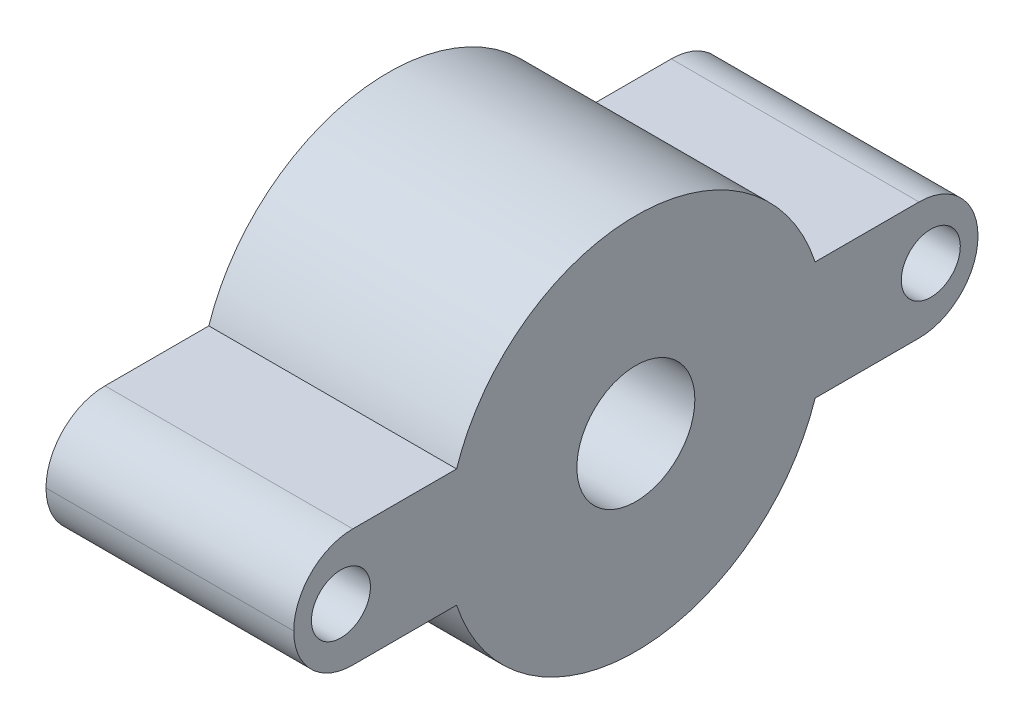
ISO-10303-21;
HEADER;
FILE_DESCRIPTION(('STEP AP214'),'2;1');
FILE_NAME('part.step','',(''),(''),'','','');
FILE_SCHEMA(('AUTOMOTIVE_DESIGN { 1 0 10303 214 1 1 1 1 }'));
ENDSEC;
DATA;
#1=APPLICATION_CONTEXT('core data for automotive mechanical design processes');
#2=APPLICATION_PROTOCOL_DEFINITION('international standard','automotive_design',2000,#1);
#3=PRODUCT_CONTEXT('',#1,'mechanical');
#4=PRODUCT('Part','Part','',(#3));
#5=PRODUCT_RELATED_PRODUCT_CATEGORY('part','',(#4));
#6=PRODUCT_DEFINITION_FORMATION('','',#4);
#7=PRODUCT_DEFINITION_CONTEXT('part definition',#1,'design');
#8=PRODUCT_DEFINITION('design','',#6,#7);
#9=PRODUCT_DEFINITION_SHAPE('','',#8);
#10=(LENGTH_UNIT() NAMED_UNIT(*) SI_UNIT(.MILLI.,.METRE.));
#11=(NAMED_UNIT(*) PLANE_ANGLE_UNIT() SI_UNIT($,.RADIAN.));
#12=(NAMED_UNIT(*) SI_UNIT($,.STERADIAN.) SOLID_ANGLE_UNIT());
#13=UNCERTAINTY_MEASURE_WITH_UNIT(LENGTH_MEASURE(1.E-05),#10,'distance_accuracy_value','');
#14=(GEOMETRIC_REPRESENTATION_CONTEXT(3) GLOBAL_UNCERTAINTY_ASSIGNED_CONTEXT((#13)) GLOBAL_UNIT_ASSIGNED_CONTEXT((#10,
#11,#12)) REPRESENTATION_CONTEXT('',''));
#15=CARTESIAN_POINT('',(0.,0.,0.));
#16=DIRECTION('',(0.,0.,1.));
#17=DIRECTION('',(1.,0.,0.));
#18=AXIS2_PLACEMENT_3D('',#15,#16,#17);
#19=CARTESIAN_POINT('',(5.,5.,-59.));
#20=DIRECTION('',(1.,0.,0.));
#21=DIRECTION('',(0.,0.,-1.));
#22=AXIS2_PLACEMENT_3D('',#19,#20,#21);
#23=CYLINDRICAL_SURFACE('',#22,5.);
#24=DIRECTION('',(1.,0.,0.));
#25=VECTOR('',#24,1.);
#26=CARTESIAN_POINT('',(5.,0.,-59.));
#27=LINE('',#26,#25);
#28=CARTESIAN_POINT('',(0.,0.,-59.));
#29=VERTEX_POINT('',#28);
#30=CARTESIAN_POINT('',(21.,0.,-59.));
#31=VERTEX_POINT('',#30);
#32=EDGE_CURVE('E190',#29,#31,#27,.T.);
#33=ORIENTED_EDGE('',*,*,#32,.F.);
#34=CARTESIAN_POINT('',(0.,5.,-59.));
#35=DIRECTION('',(-1.,0.,0.));
#36=DIRECTION('',(0.,0.,1.));
#37=AXIS2_PLACEMENT_3D('',#34,#35,#36);
#38=CIRCLE('',#37,5.);
#39=CARTESIAN_POINT('',(0.,5.,-64.));
#40=VERTEX_POINT('',#39);
#41=EDGE_CURVE('E39',#40,#29,#38,.T.);
#42=ORIENTED_EDGE('',*,*,#41,.F.);
#43=DIRECTION('',(-1.,0.,0.));
#44=VECTOR('',#43,1.);
#45=CARTESIAN_POINT('',(40.,5.,-64.));
#46=LINE('',#45,#44);
#47=CARTESIAN_POINT('',(21.,5.,-64.));
#48=VERTEX_POINT('',#47);
#49=EDGE_CURVE('E169',#40,#48,#46,.F.);
#50=ORIENTED_EDGE('',*,*,#49,.T.);
#51=CARTESIAN_POINT('',(21.,5.,-59.));
#52=DIRECTION('',(1.,0.,0.));
#53=DIRECTION('',(0.,0.,-1.));
#54=AXIS2_PLACEMENT_3D('',#51,#52,#53);
#55=CIRCLE('',#54,5.);
#56=EDGE_CURVE('E11',#31,#48,#55,.T.);
#57=ORIENTED_EDGE('',*,*,#56,.F.);
#58=EDGE_LOOP('',(#33,#42,#50,#57));
#59=FACE_BOUND('',#58,.T.);
#60=ADVANCED_FACE('F32',(#59),#23,.T.);
#61=CARTESIAN_POINT('',(40.,5.,-11.));
#62=DIRECTION('',(1.,0.,0.));
#63=DIRECTION('',(0.,0.,-1.));
#64=AXIS2_PLACEMENT_3D('',#61,#62,#63);
#65=CYLINDRICAL_SURFACE('',#64,5.);
#66=DIRECTION('',(1.,0.,0.));
#67=VECTOR('',#66,1.);
#68=CARTESIAN_POINT('',(40.,5.,-6.));
#69=LINE('',#68,#67);
#70=CARTESIAN_POINT('',(21.,5.,-5.99999999999999));
#71=VERTEX_POINT('',#70);
#72=CARTESIAN_POINT('',(0.,5.,-6.));
#73=VERTEX_POINT('',#72);
#74=EDGE_CURVE('E176',#71,#73,#69,.F.);
#75=ORIENTED_EDGE('',*,*,#74,.T.);
#76=CARTESIAN_POINT('',(0.,5.,-11.));
#77=DIRECTION('',(-1.,0.,0.));
#78=DIRECTION('',(0.,0.,1.));
#79=AXIS2_PLACEMENT_3D('',#76,#77,#78);
#80=CIRCLE('',#79,5.);
#81=CARTESIAN_POINT('',(0.,0.,-11.));
#82=VERTEX_POINT('',#81);
#83=EDGE_CURVE('E186',#82,#73,#80,.T.);
#84=ORIENTED_EDGE('',*,*,#83,.F.);
#85=DIRECTION('',(1.,0.,0.));
#86=VECTOR('',#85,1.);
#87=CARTESIAN_POINT('',(5.,0.,-11.));
#88=LINE('',#87,#86);
#89=CARTESIAN_POINT('',(21.,0.,-11.));
#90=VERTEX_POINT('',#89);
#91=EDGE_CURVE('E183',#90,#82,#88,.F.);
#92=ORIENTED_EDGE('',*,*,#91,.F.);
#93=CARTESIAN_POINT('',(21.,5.,-11.));
#94=DIRECTION('',(1.,0.,0.));
#95=DIRECTION('',(0.,0.,-1.));
#96=AXIS2_PLACEMENT_3D('',#93,#94,#95);
#97=CIRCLE('',#96,5.);
#98=EDGE_CURVE('E188',#71,#90,#97,.T.);
#99=ORIENTED_EDGE('',*,*,#98,.F.);
#100=EDGE_LOOP('',(#75,#84,#92,#99));
#101=FACE_BOUND('',#100,.T.);
#102=ADVANCED_FACE('F219',(#101),#65,.T.);
#103=CARTESIAN_POINT('',(5.,5.,-11.));
#104=DIRECTION('',(1.,0.,0.));
#105=DIRECTION('',(0.,0.,-1.));
#106=AXIS2_PLACEMENT_3D('',#103,#104,#105);
#107=CYLINDRICAL_SURFACE('',#106,5.);
#108=DIRECTION('',(1.,0.,0.));
#109=VECTOR('',#108,1.);
#110=CARTESIAN_POINT('',(5.,10.,-11.));
#111=LINE('',#110,#109);
#112=CARTESIAN_POINT('',(0.,10.,-11.));
#113=VERTEX_POINT('',#112);
#114=CARTESIAN_POINT('',(21.,10.,-11.));
#115=VERTEX_POINT('',#114);
#116=EDGE_CURVE('E124',#113,#115,#111,.T.);
#117=ORIENTED_EDGE('',*,*,#116,.F.);
#118=CARTESIAN_POINT('',(0.,5.,-11.));
#119=DIRECTION('',(-1.,0.,0.));
#120=DIRECTION('',(0.,0.,1.));
#121=AXIS2_PLACEMENT_3D('',#118,#119,#120);
#122=CIRCLE('',#121,5.);
#123=EDGE_CURVE('E179',#73,#113,#122,.T.);
#124=ORIENTED_EDGE('',*,*,#123,.F.);
#125=ORIENTED_EDGE('',*,*,#74,.F.);
#126=CARTESIAN_POINT('',(21.,5.,-11.));
#127=DIRECTION('',(1.,0.,0.));
#128=DIRECTION('',(0.,0.,-1.));
#129=AXIS2_PLACEMENT_3D('',#126,#127,#128);
#130=CIRCLE('',#129,5.);
#131=EDGE_CURVE('E181',#115,#71,#130,.T.);
#132=ORIENTED_EDGE('',*,*,#131,.F.);
#133=EDGE_LOOP('',(#117,#124,#125,#132));
#134=FACE_BOUND('',#133,.T.);
#135=ADVANCED_FACE('F222',(#134),#107,.T.);
#136=CARTESIAN_POINT('',(5.,5.,-59.));
#137=DIRECTION('',(-1.,0.,0.));
#138=DIRECTION('',(0.,0.,1.));
#139=AXIS2_PLACEMENT_3D('',#136,#137,#138);
#140=CYLINDRICAL_SURFACE('',#139,5.);
#141=DIRECTION('',(-1.,0.,0.));
#142=VECTOR('',#141,1.);
#143=CARTESIAN_POINT('',(5.,10.,-59.));
#144=LINE('',#143,#142);
#145=CARTESIAN_POINT('',(21.,10.,-59.));
#146=VERTEX_POINT('',#145);
#147=CARTESIAN_POINT('',(0.,10.,-59.));
#148=VERTEX_POINT('',#147);
#149=EDGE_CURVE('E152',#146,#148,#144,.T.);
#150=ORIENTED_EDGE('',*,*,#149,.F.);
#151=CARTESIAN_POINT('',(21.,5.,-59.));
#152=DIRECTION('',(1.,0.,0.));
#153=DIRECTION('',(0.,0.,-1.));
#154=AXIS2_PLACEMENT_3D('',#151,#152,#153);
#155=CIRCLE('',#154,5.);
#156=EDGE_CURVE('E171',#48,#146,#155,.T.);
#157=ORIENTED_EDGE('',*,*,#156,.F.);
#158=ORIENTED_EDGE('',*,*,#49,.F.);
#159=CARTESIAN_POINT('',(0.,5.,-59.));
#160=DIRECTION('',(-1.,0.,0.));
#161=DIRECTION('',(0.,0.,1.));
#162=AXIS2_PLACEMENT_3D('',#159,#160,#161);
#163=CIRCLE('',#162,5.);
#164=EDGE_CURVE('E173',#148,#40,#163,.T.);
#165=ORIENTED_EDGE('',*,*,#164,.F.);
#166=EDGE_LOOP('',(#150,#157,#158,#165));
#167=FACE_BOUND('',#166,.T.);
#168=ADVANCED_FACE('F229',(#167),#140,.T.);
#169=CARTESIAN_POINT('',(21.,5.,-35.));
#170=DIRECTION('',(-1.,0.,0.));
#171=DIRECTION('',(0.,0.,1.));
#172=AXIS2_PLACEMENT_3D('',#169,#170,#171);
#173=CYLINDRICAL_SURFACE('',#172,16.);
#174=DIRECTION('',(-1.,0.,0.));
#175=VECTOR('',#174,1.);
#176=CARTESIAN_POINT('',(21.,0.,-50.1986841535707));
#177=LINE('',#176,#175);
#178=CARTESIAN_POINT('',(0.,0.,-50.1986841535707));
#179=VERTEX_POINT('',#178);
#180=CARTESIAN_POINT('',(21.,0.,-50.1986841535707));
#181=VERTEX_POINT('',#180);
#182=EDGE_CURVE('E144',#179,#181,#177,.F.);
#183=ORIENTED_EDGE('',*,*,#182,.T.);
#184=CARTESIAN_POINT('',(21.,5.,-35.));
#185=DIRECTION('',(1.,0.,0.));
#186=DIRECTION('',(0.,0.,-1.));
#187=AXIS2_PLACEMENT_3D('',#184,#185,#186);
#188=CIRCLE('',#187,16.);
#189=CARTESIAN_POINT('',(21.,0.,-19.8013158464293));
#190=VERTEX_POINT('',#189);
#191=EDGE_CURVE('E135',#190,#181,#188,.T.);
#192=ORIENTED_EDGE('',*,*,#191,.F.);
#193=DIRECTION('',(-1.,0.,0.));
#194=VECTOR('',#193,1.);
#195=CARTESIAN_POINT('',(21.,0.,-19.8013158464293));
#196=LINE('',#195,#194);
#197=CARTESIAN_POINT('',(0.,0.,-19.8013158464293));
#198=VERTEX_POINT('',#197);
#199=EDGE_CURVE('E117',#190,#198,#196,.T.);
#200=ORIENTED_EDGE('',*,*,#199,.T.);
#201=CARTESIAN_POINT('',(0.,5.,-35.));
#202=DIRECTION('',(1.,0.,0.));
#203=DIRECTION('',(0.,0.,-1.));
#204=AXIS2_PLACEMENT_3D('',#201,#202,#203);
#205=CIRCLE('',#204,16.);
#206=EDGE_CURVE('E204',#198,#179,#205,.T.);
#207=ORIENTED_EDGE('',*,*,#206,.T.);
#208=EDGE_LOOP('',(#183,#192,#200,#207));
#209=FACE_BOUND('',#208,.T.);
#210=ADVANCED_FACE('F208',(#209),#173,.T.);
#211=DIRECTION('',(-1.,0.,0.));
#212=VECTOR('',#211,1.);
#213=CARTESIAN_POINT('',(21.,10.,-19.8013158464293));
#214=LINE('',#213,#212);
#215=CARTESIAN_POINT('',(0.,10.,-19.8013158464293));
#216=VERTEX_POINT('',#215);
#217=CARTESIAN_POINT('',(21.,10.,-19.8013158464293));
#218=VERTEX_POINT('',#217);
#219=EDGE_CURVE('E106',#216,#218,#214,.F.);
#220=ORIENTED_EDGE('',*,*,#219,.T.);
#221=CARTESIAN_POINT('',(21.,10.,-50.1986841535707));
#222=VERTEX_POINT('',#221);
#223=EDGE_CURVE('E111',#222,#218,#188,.T.);
#224=ORIENTED_EDGE('',*,*,#223,.F.);
#225=DIRECTION('',(-1.,0.,0.));
#226=VECTOR('',#225,1.);
#227=CARTESIAN_POINT('',(21.,10.,-50.1986841535707));
#228=LINE('',#227,#226);
#229=CARTESIAN_POINT('',(0.,10.,-50.1986841535707));
#230=VERTEX_POINT('',#229);
#231=EDGE_CURVE('E142',#222,#230,#228,.T.);
#232=ORIENTED_EDGE('',*,*,#231,.T.);
#233=EDGE_CURVE('E113',#230,#216,#205,.T.);
#234=ORIENTED_EDGE('',*,*,#233,.T.);
#235=EDGE_LOOP('',(#220,#224,#232,#234));
#236=FACE_BOUND('',#235,.T.);
#237=ADVANCED_FACE('F108',(#236),#173,.T.);
#238=CARTESIAN_POINT('',(5.,0.,0.));
#239=DIRECTION('',(0.,1.,0.));
#240=DIRECTION('',(0.,0.,1.));
#241=AXIS2_PLACEMENT_3D('',#238,#239,#240);
#242=PLANE('',#241);
#243=DIRECTION('',(0.,0.,-1.));
#244=VECTOR('',#243,1.);
#245=CARTESIAN_POINT('',(0.,0.,0.));
#246=LINE('',#245,#244);
#247=EDGE_CURVE('E146',#179,#29,#246,.T.);
#248=ORIENTED_EDGE('',*,*,#247,.T.);
#249=ORIENTED_EDGE('',*,*,#32,.T.);
#250=DIRECTION('',(0.,0.,-1.));
#251=VECTOR('',#250,1.);
#252=CARTESIAN_POINT('',(21.,0.,0.));
#253=LINE('',#252,#251);
#254=EDGE_CURVE('E195',#181,#31,#253,.T.);
#255=ORIENTED_EDGE('',*,*,#254,.F.);
#256=ORIENTED_EDGE('',*,*,#182,.F.);
#257=EDGE_LOOP('',(#248,#249,#255,#256));
#258=FACE_BOUND('',#257,.T.);
#259=ADVANCED_FACE('F194',(#258),#242,.F.);
#260=EDGE_CURVE('E128',#90,#190,#253,.T.);
#261=ORIENTED_EDGE('',*,*,#260,.F.);
#262=ORIENTED_EDGE('',*,*,#91,.T.);
#263=EDGE_CURVE('E147',#82,#198,#246,.T.);
#264=ORIENTED_EDGE('',*,*,#263,.T.);
#265=ORIENTED_EDGE('',*,*,#199,.F.);
#266=EDGE_LOOP('',(#261,#262,#264,#265));
#267=FACE_BOUND('',#266,.T.);
#268=ADVANCED_FACE('F216',(#267),#242,.F.);
#269=CARTESIAN_POINT('',(5.,10.,0.));
#270=DIRECTION('',(0.,-1.,0.));
#271=DIRECTION('',(0.,0.,-1.));
#272=AXIS2_PLACEMENT_3D('',#269,#270,#271);
#273=PLANE('',#272);
#274=DIRECTION('',(0.,0.,1.));
#275=VECTOR('',#274,1.);
#276=CARTESIAN_POINT('',(0.,10.,0.));
#277=LINE('',#276,#275);
#278=EDGE_CURVE('E149',#216,#113,#277,.T.);
#279=ORIENTED_EDGE('',*,*,#278,.T.);
#280=ORIENTED_EDGE('',*,*,#116,.T.);
#281=DIRECTION('',(0.,0.,1.));
#282=VECTOR('',#281,1.);
#283=CARTESIAN_POINT('',(21.,10.,0.));
#284=LINE('',#283,#282);
#285=EDGE_CURVE('E121',#218,#115,#284,.T.);
#286=ORIENTED_EDGE('',*,*,#285,.F.);
#287=ORIENTED_EDGE('',*,*,#219,.F.);
#288=EDGE_LOOP('',(#279,#280,#286,#287));
#289=FACE_BOUND('',#288,.T.);
#290=ADVANCED_FACE('F122',(#289),#273,.F.);
#291=EDGE_CURVE('E127',#146,#222,#284,.T.);
#292=ORIENTED_EDGE('',*,*,#291,.F.);
#293=ORIENTED_EDGE('',*,*,#149,.T.);
#294=EDGE_CURVE('E150',#148,#230,#277,.T.);
#295=ORIENTED_EDGE('',*,*,#294,.T.);
#296=ORIENTED_EDGE('',*,*,#231,.F.);
#297=EDGE_LOOP('',(#292,#293,#295,#296));
#298=FACE_BOUND('',#297,.T.);
#299=ADVANCED_FACE('F226',(#298),#273,.F.);
#300=CARTESIAN_POINT('',(0.,0.,0.));
#301=DIRECTION('',(-1.,0.,0.));
#302=DIRECTION('',(0.,0.,1.));
#303=AXIS2_PLACEMENT_3D('',#300,#301,#302);
#304=PLANE('',#303);
#305=ORIENTED_EDGE('',*,*,#164,.T.);
#306=ORIENTED_EDGE('',*,*,#41,.T.);
#307=ORIENTED_EDGE('',*,*,#247,.F.);
#308=ORIENTED_EDGE('',*,*,#206,.F.);
#309=ORIENTED_EDGE('',*,*,#263,.F.);
#310=ORIENTED_EDGE('',*,*,#83,.T.);
#311=ORIENTED_EDGE('',*,*,#123,.T.);
#312=ORIENTED_EDGE('',*,*,#278,.F.);
#313=ORIENTED_EDGE('',*,*,#233,.F.);
#314=ORIENTED_EDGE('',*,*,#294,.F.);
#315=EDGE_LOOP('',(#305,#306,#307,#308,#309,#310,#311,#312,#313,#314));
#316=FACE_BOUND('',#315,.T.);
#317=CARTESIAN_POINT('',(0.,5.,-35.));
#318=DIRECTION('',(-1.,0.,0.));
#319=DIRECTION('',(0.,0.,1.));
#320=AXIS2_PLACEMENT_3D('',#317,#318,#319);
#321=CIRCLE('',#320,12.);
#322=CARTESIAN_POINT('',(0.,5.,-23.));
#323=VERTEX_POINT('',#322);
#324=EDGE_CURVE('E165',#323,#323,#321,.T.);
#325=ORIENTED_EDGE('',*,*,#324,.F.);
#326=EDGE_LOOP('',(#325));
#327=FACE_BOUND('',#326,.T.);
#328=CARTESIAN_POINT('',(0.,5.,-60.));
#329=DIRECTION('',(-1.,0.,0.));
#330=DIRECTION('',(0.,0.,1.));
#331=AXIS2_PLACEMENT_3D('',#328,#329,#330);
#332=CIRCLE('',#331,1.5);
#333=CARTESIAN_POINT('',(0.,5.,-58.5));
#334=VERTEX_POINT('',#333);
#335=EDGE_CURVE('E157',#334,#334,#332,.T.);
#336=ORIENTED_EDGE('',*,*,#335,.F.);
#337=EDGE_LOOP('',(#336));
#338=FACE_BOUND('',#337,.T.);
#339=CARTESIAN_POINT('',(0.,5.,-10.));
#340=DIRECTION('',(-1.,0.,0.));
#341=DIRECTION('',(0.,0.,1.));
#342=AXIS2_PLACEMENT_3D('',#339,#340,#341);
#343=CIRCLE('',#342,1.5);
#344=CARTESIAN_POINT('',(0.,5.,-8.5));
#345=VERTEX_POINT('',#344);
#346=EDGE_CURVE('E156',#345,#345,#343,.T.);
#347=ORIENTED_EDGE('',*,*,#346,.F.);
#348=EDGE_LOOP('',(#347));
#349=FACE_BOUND('',#348,.T.);
#350=ADVANCED_FACE('F211',(#316,#327,#338,#349),#304,.T.);
#351=CARTESIAN_POINT('',(21.,5.,-35.));
#352=DIRECTION('',(1.,0.,0.));
#353=DIRECTION('',(0.,0.,-1.));
#354=AXIS2_PLACEMENT_3D('',#351,#352,#353);
#355=PLANE('',#354);
#356=ORIENTED_EDGE('',*,*,#254,.T.);
#357=ORIENTED_EDGE('',*,*,#56,.T.);
#358=ORIENTED_EDGE('',*,*,#156,.T.);
#359=ORIENTED_EDGE('',*,*,#291,.T.);
#360=ORIENTED_EDGE('',*,*,#223,.T.);
#361=ORIENTED_EDGE('',*,*,#285,.T.);
#362=ORIENTED_EDGE('',*,*,#131,.T.);
#363=ORIENTED_EDGE('',*,*,#98,.T.);
#364=ORIENTED_EDGE('',*,*,#260,.T.);
#365=ORIENTED_EDGE('',*,*,#191,.T.);
#366=EDGE_LOOP('',(#356,#357,#358,#359,#360,#361,#362,#363,#364,#365));
#367=FACE_BOUND('',#366,.T.);
#368=CARTESIAN_POINT('',(21.,5.,-35.));
#369=DIRECTION('',(1.,0.,0.));
#370=DIRECTION('',(0.,0.,-1.));
#371=AXIS2_PLACEMENT_3D('',#368,#369,#370);
#372=CIRCLE('',#371,5.);
#373=CARTESIAN_POINT('',(21.,5.,-40.));
#374=VERTEX_POINT('',#373);
#375=EDGE_CURVE('E166',#374,#374,#372,.T.);
#376=ORIENTED_EDGE('',*,*,#375,.F.);
#377=EDGE_LOOP('',(#376));
#378=FACE_BOUND('',#377,.T.);
#379=CARTESIAN_POINT('',(21.,5.,-60.));
#380=DIRECTION('',(1.,0.,0.));
#381=DIRECTION('',(0.,0.,-1.));
#382=AXIS2_PLACEMENT_3D('',#379,#380,#381);
#383=CIRCLE('',#382,2.49999999999999);
#384=CARTESIAN_POINT('',(21.,5.,-62.5));
#385=VERTEX_POINT('',#384);
#386=EDGE_CURVE('E302',#385,#385,#383,.T.);
#387=ORIENTED_EDGE('',*,*,#386,.F.);
#388=EDGE_LOOP('',(#387));
#389=FACE_BOUND('',#388,.T.);
#390=CARTESIAN_POINT('',(21.,5.,-10.));
#391=DIRECTION('',(1.,0.,0.));
#392=DIRECTION('',(0.,0.,-1.));
#393=AXIS2_PLACEMENT_3D('',#390,#391,#392);
#394=CIRCLE('',#393,2.5);
#395=CARTESIAN_POINT('',(21.,5.,-12.5));
#396=VERTEX_POINT('',#395);
#397=EDGE_CURVE('E201',#396,#396,#394,.T.);
#398=ORIENTED_EDGE('',*,*,#397,.F.);
#399=EDGE_LOOP('',(#398));
#400=FACE_BOUND('',#399,.T.);
#401=ADVANCED_FACE('F131',(#367,#378,#389,#400),#355,.T.);
#402=CARTESIAN_POINT('',(10.,5.,-10.));
#403=DIRECTION('',(1.,0.,0.));
#404=DIRECTION('',(0.,0.,-1.));
#405=AXIS2_PLACEMENT_3D('',#402,#403,#404);
#406=CYLINDRICAL_SURFACE('',#405,2.5);
#407=CARTESIAN_POINT('',(10.,5.,-10.));
#408=DIRECTION('',(1.,0.,0.));
#409=DIRECTION('',(0.,0.,-1.));
#410=AXIS2_PLACEMENT_3D('',#407,#408,#409);
#411=CIRCLE('',#410,2.5);
#412=CARTESIAN_POINT('',(10.,5.,-12.5));
#413=VERTEX_POINT('',#412);
#414=EDGE_CURVE('E198',#413,#413,#411,.T.);
#415=ORIENTED_EDGE('',*,*,#414,.F.);
#416=EDGE_LOOP('',(#415));
#417=FACE_BOUND('',#416,.T.);
#418=ORIENTED_EDGE('',*,*,#397,.T.);
#419=EDGE_LOOP('',(#418));
#420=FACE_BOUND('',#419,.T.);
#421=ADVANCED_FACE('F251',(#417,#420),#406,.F.);
#422=CARTESIAN_POINT('',(10.,5.,-10.));
#423=DIRECTION('',(1.,0.,0.));
#424=DIRECTION('',(0.,0.,-1.));
#425=AXIS2_PLACEMENT_3D('',#422,#423,#424);
#426=PLANE('',#425);
#427=CARTESIAN_POINT('',(10.,5.,-10.));
#428=DIRECTION('',(1.,0.,0.));
#429=DIRECTION('',(0.,0.,-1.));
#430=AXIS2_PLACEMENT_3D('',#427,#428,#429);
#431=CIRCLE('',#430,1.5);
#432=CARTESIAN_POINT('',(10.,5.,-11.5));
#433=VERTEX_POINT('',#432);
#434=EDGE_CURVE('E153',#433,#433,#431,.T.);
#435=ORIENTED_EDGE('',*,*,#434,.F.);
#436=EDGE_LOOP('',(#435));
#437=FACE_BOUND('',#436,.T.);
#438=ORIENTED_EDGE('',*,*,#414,.T.);
#439=EDGE_LOOP('',(#438));
#440=FACE_BOUND('',#439,.T.);
#441=ADVANCED_FACE('F254',(#437,#440),#426,.T.);
#442=CARTESIAN_POINT('',(10.,5.,-60.));
#443=DIRECTION('',(1.,0.,0.));
#444=DIRECTION('',(0.,0.,-1.));
#445=AXIS2_PLACEMENT_3D('',#442,#443,#444);
#446=CYLINDRICAL_SURFACE('',#445,2.49999999999999);
#447=CARTESIAN_POINT('',(10.,5.,-60.));
#448=DIRECTION('',(1.,0.,0.));
#449=DIRECTION('',(0.,0.,-1.));
#450=AXIS2_PLACEMENT_3D('',#447,#448,#449);
#451=CIRCLE('',#450,2.49999999999999);
#452=CARTESIAN_POINT('',(10.,5.,-62.5));
#453=VERTEX_POINT('',#452);
#454=EDGE_CURVE('E303',#453,#453,#451,.T.);
#455=ORIENTED_EDGE('',*,*,#454,.F.);
#456=EDGE_LOOP('',(#455));
#457=FACE_BOUND('',#456,.T.);
#458=ORIENTED_EDGE('',*,*,#386,.T.);
#459=EDGE_LOOP('',(#458));
#460=FACE_BOUND('',#459,.T.);
#461=ADVANCED_FACE('F258',(#457,#460),#446,.F.);
#462=CARTESIAN_POINT('',(10.,5.,-60.));
#463=DIRECTION('',(1.,0.,0.));
#464=DIRECTION('',(0.,0.,-1.));
#465=AXIS2_PLACEMENT_3D('',#462,#463,#464);
#466=PLANE('',#465);
#467=CARTESIAN_POINT('',(10.,5.,-60.));
#468=DIRECTION('',(1.,0.,0.));
#469=DIRECTION('',(0.,0.,-1.));
#470=AXIS2_PLACEMENT_3D('',#467,#468,#469);
#471=CIRCLE('',#470,1.5);
#472=CARTESIAN_POINT('',(10.,5.,-61.5));
#473=VERTEX_POINT('',#472);
#474=EDGE_CURVE('E158',#473,#473,#471,.T.);
#475=ORIENTED_EDGE('',*,*,#474,.F.);
#476=EDGE_LOOP('',(#475));
#477=FACE_BOUND('',#476,.T.);
#478=ORIENTED_EDGE('',*,*,#454,.T.);
#479=EDGE_LOOP('',(#478));
#480=FACE_BOUND('',#479,.T.);
#481=ADVANCED_FACE('F262',(#477,#480),#466,.T.);
#482=CARTESIAN_POINT('',(-17.,5.,-10.));
#483=DIRECTION('',(1.,0.,0.));
#484=DIRECTION('',(0.,0.,-1.));
#485=AXIS2_PLACEMENT_3D('',#482,#483,#484);
#486=CYLINDRICAL_SURFACE('',#485,1.5);
#487=ORIENTED_EDGE('',*,*,#346,.T.);
#488=EDGE_LOOP('',(#487));
#489=FACE_BOUND('',#488,.T.);
#490=ORIENTED_EDGE('',*,*,#434,.T.);
#491=EDGE_LOOP('',(#490));
#492=FACE_BOUND('',#491,.T.);
#493=ADVANCED_FACE('F266',(#489,#492),#486,.F.);
#494=CARTESIAN_POINT('',(-17.,5.,-60.));
#495=DIRECTION('',(1.,0.,0.));
#496=DIRECTION('',(0.,0.,-1.));
#497=AXIS2_PLACEMENT_3D('',#494,#495,#496);
#498=CYLINDRICAL_SURFACE('',#497,1.5);
#499=ORIENTED_EDGE('',*,*,#335,.T.);
#500=EDGE_LOOP('',(#499));
#501=FACE_BOUND('',#500,.T.);
#502=ORIENTED_EDGE('',*,*,#474,.T.);
#503=EDGE_LOOP('',(#502));
#504=FACE_BOUND('',#503,.T.);
#505=ADVANCED_FACE('F270',(#501,#504),#498,.F.);
#506=CARTESIAN_POINT('',(11.,5.,-35.));
#507=DIRECTION('',(-1.,0.,0.));
#508=DIRECTION('',(0.,0.,1.));
#509=AXIS2_PLACEMENT_3D('',#506,#507,#508);
#510=CYLINDRICAL_SURFACE('',#509,12.);
#511=CARTESIAN_POINT('',(11.,5.,-35.));
#512=DIRECTION('',(-1.,0.,0.));
#513=DIRECTION('',(0.,0.,1.));
#514=AXIS2_PLACEMENT_3D('',#511,#512,#513);
#515=CIRCLE('',#514,12.);
#516=CARTESIAN_POINT('',(11.,5.,-23.));
#517=VERTEX_POINT('',#516);
#518=EDGE_CURVE('E161',#517,#517,#515,.T.);
#519=ORIENTED_EDGE('',*,*,#518,.F.);
#520=EDGE_LOOP('',(#519));
#521=FACE_BOUND('',#520,.T.);
#522=ORIENTED_EDGE('',*,*,#324,.T.);
#523=EDGE_LOOP('',(#522));
#524=FACE_BOUND('',#523,.T.);
#525=ADVANCED_FACE('F274',(#521,#524),#510,.F.);
#526=CARTESIAN_POINT('',(11.,5.,-35.));
#527=DIRECTION('',(-1.,0.,0.));
#528=DIRECTION('',(0.,0.,1.));
#529=AXIS2_PLACEMENT_3D('',#526,#527,#528);
#530=PLANE('',#529);
#531=CARTESIAN_POINT('',(11.,5.,-35.));
#532=DIRECTION('',(-1.,0.,0.));
#533=DIRECTION('',(0.,0.,1.));
#534=AXIS2_PLACEMENT_3D('',#531,#532,#533);
#535=CIRCLE('',#534,5.);
#536=CARTESIAN_POINT('',(11.,5.,-30.));
#537=VERTEX_POINT('',#536);
#538=EDGE_CURVE('E162',#537,#537,#535,.T.);
#539=ORIENTED_EDGE('',*,*,#538,.F.);
#540=EDGE_LOOP('',(#539));
#541=FACE_BOUND('',#540,.T.);
#542=ORIENTED_EDGE('',*,*,#518,.T.);
#543=EDGE_LOOP('',(#542));
#544=FACE_BOUND('',#543,.T.);
#545=ADVANCED_FACE('F278',(#541,#544),#530,.T.);
#546=CARTESIAN_POINT('',(-19.,5.,-35.));
#547=DIRECTION('',(1.,0.,0.));
#548=DIRECTION('',(0.,0.,-1.));
#549=AXIS2_PLACEMENT_3D('',#546,#547,#548);
#550=CYLINDRICAL_SURFACE('',#549,5.);
#551=ORIENTED_EDGE('',*,*,#538,.T.);
#552=EDGE_LOOP('',(#551));
#553=FACE_BOUND('',#552,.T.);
#554=ORIENTED_EDGE('',*,*,#375,.T.);
#555=EDGE_LOOP('',(#554));
#556=FACE_BOUND('',#555,.T.);
#557=ADVANCED_FACE('F282',(#553,#556),#550,.F.);
#558=CLOSED_SHELL('',(#60,#102,#135,#168,#210,#237,#259,#268,#290,#299,#350,#401,#421,#441,#461,
#481,#493,#505,#525,#545,#557));
#559=MANIFOLD_SOLID_BREP('B2',#558);
#560=ADVANCED_BREP_SHAPE_REPRESENTATION('',(#18,#559),#14);
#561=SHAPE_DEFINITION_REPRESENTATION(#9,#560);
ENDSEC;
END-ISO-10303-21;
